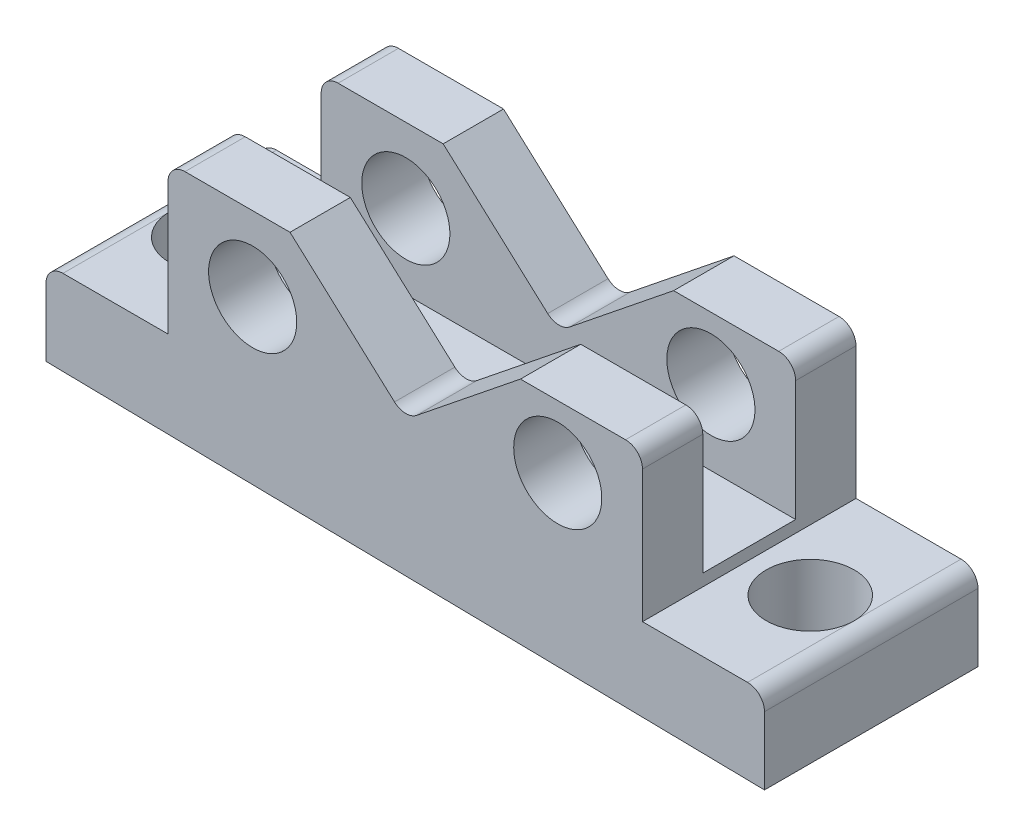
ISO-10303-21;
HEADER;
FILE_DESCRIPTION(('STEP AP214'),'2;1');
FILE_NAME('part.step','',(''),(''),'','','');
FILE_SCHEMA(('AUTOMOTIVE_DESIGN { 1 0 10303 214 1 1 1 1 }'));
ENDSEC;
DATA;
#1=APPLICATION_CONTEXT('core data for automotive mechanical design processes');
#2=APPLICATION_PROTOCOL_DEFINITION('international standard','automotive_design',2000,#1);
#3=PRODUCT_CONTEXT('',#1,'mechanical');
#4=PRODUCT('Part','Part','',(#3));
#5=PRODUCT_RELATED_PRODUCT_CATEGORY('part','',(#4));
#6=PRODUCT_DEFINITION_FORMATION('','',#4);
#7=PRODUCT_DEFINITION_CONTEXT('part definition',#1,'design');
#8=PRODUCT_DEFINITION('design','',#6,#7);
#9=PRODUCT_DEFINITION_SHAPE('','',#8);
#10=(LENGTH_UNIT() NAMED_UNIT(*) SI_UNIT(.MILLI.,.METRE.));
#11=(NAMED_UNIT(*) PLANE_ANGLE_UNIT() SI_UNIT($,.RADIAN.));
#12=(NAMED_UNIT(*) SI_UNIT($,.STERADIAN.) SOLID_ANGLE_UNIT());
#13=UNCERTAINTY_MEASURE_WITH_UNIT(LENGTH_MEASURE(1.E-05),#10,'distance_accuracy_value','');
#14=(GEOMETRIC_REPRESENTATION_CONTEXT(3) GLOBAL_UNCERTAINTY_ASSIGNED_CONTEXT((#13)) GLOBAL_UNIT_ASSIGNED_CONTEXT((#10,
#11,#12)) REPRESENTATION_CONTEXT('',''));
#15=CARTESIAN_POINT('',(0.,0.,0.));
#16=DIRECTION('',(0.,0.,1.));
#17=DIRECTION('',(1.,0.,0.));
#18=AXIS2_PLACEMENT_3D('',#15,#16,#17);
#19=CARTESIAN_POINT('',(176.,65.4832020096628,63.));
#20=DIRECTION('',(0.,-1.,0.));
#21=DIRECTION('',(0.,0.,-1.));
#22=AXIS2_PLACEMENT_3D('',#19,#20,#21);
#23=PLANE('',#22);
#24=DIRECTION('',(1.,0.,0.));
#25=VECTOR('',#24,1.);
#26=CARTESIAN_POINT('',(176.,65.4832020096628,17.8074312530399));
#27=LINE('',#26,#25);
#28=CARTESIAN_POINT('',(140.,65.4832020096628,17.8074312530399));
#29=VERTEX_POINT('',#28);
#30=CARTESIAN_POINT('',(171.,65.4832020096628,17.8074312530399));
#31=VERTEX_POINT('',#30);
#32=EDGE_CURVE('E453',#29,#31,#27,.T.);
#33=ORIENTED_EDGE('',*,*,#32,.T.);
#34=DIRECTION('',(0.,0.,-1.));
#35=VECTOR('',#34,1.);
#36=CARTESIAN_POINT('',(171.,65.4832020096628,63.));
#37=LINE('',#36,#35);
#38=CARTESIAN_POINT('',(171.,65.4832020096628,0.));
#39=VERTEX_POINT('',#38);
#40=EDGE_CURVE('E318',#31,#39,#37,.T.);
#41=ORIENTED_EDGE('',*,*,#40,.T.);
#42=DIRECTION('',(-1.,0.,0.));
#43=VECTOR('',#42,1.);
#44=CARTESIAN_POINT('',(176.,65.4832020096628,0.));
#45=LINE('',#44,#43);
#46=CARTESIAN_POINT('',(140.,65.4832020096628,0.));
#47=VERTEX_POINT('',#46);
#48=EDGE_CURVE('E407',#39,#47,#45,.T.);
#49=ORIENTED_EDGE('',*,*,#48,.T.);
#50=DIRECTION('',(0.,0.,-1.));
#51=VECTOR('',#50,1.);
#52=CARTESIAN_POINT('',(140.,65.4832020096628,63.));
#53=LINE('',#52,#51);
#54=EDGE_CURVE('E247',#29,#47,#53,.T.);
#55=ORIENTED_EDGE('',*,*,#54,.F.);
#56=EDGE_LOOP('',(#33,#41,#49,#55));
#57=FACE_BOUND('',#56,.T.);
#58=ADVANCED_FACE('F33',(#57),#23,.F.);
#59=CARTESIAN_POINT('',(106.,38.1932207706609,63.));
#60=DIRECTION('',(0.625952716539605,-0.779861011114602,0.));
#61=DIRECTION('',(0.779861011114602,0.625952716539605,0.));
#62=AXIS2_PLACEMENT_3D('',#59,#60,#61);
#63=PLANE('',#62);
#64=DIRECTION('',(-0.779861011114602,-0.625952716539605,0.));
#65=VECTOR('',#64,1.);
#66=CARTESIAN_POINT('',(106.,38.1932207706609,0.));
#67=LINE('',#66,#65);
#68=CARTESIAN_POINT('',(109.326280128855,40.8630478974877,0.));
#69=VERTEX_POINT('',#68);
#70=EDGE_CURVE('E409',#47,#69,#67,.T.);
#71=ORIENTED_EDGE('',*,*,#70,.T.);
#72=DIRECTION('',(0.,0.,-1.));
#73=VECTOR('',#72,1.);
#74=CARTESIAN_POINT('',(109.326280128855,40.8630478974877,17.8074312530399));
#75=LINE('',#74,#73);
#76=CARTESIAN_POINT('',(109.326280128855,40.8630478974877,17.8074312530399));
#77=VERTEX_POINT('',#76);
#78=EDGE_CURVE('E283',#69,#77,#75,.F.);
#79=ORIENTED_EDGE('',*,*,#78,.T.);
#80=DIRECTION('',(0.779861011114602,0.625952716539605,0.));
#81=VECTOR('',#80,1.);
#82=CARTESIAN_POINT('',(106.,38.1932207706609,17.8074312530399));
#83=LINE('',#82,#81);
#84=EDGE_CURVE('E451',#77,#29,#83,.T.);
#85=ORIENTED_EDGE('',*,*,#84,.T.);
#86=ORIENTED_EDGE('',*,*,#54,.T.);
#87=EDGE_LOOP('',(#71,#79,#85,#86));
#88=FACE_BOUND('',#87,.T.);
#89=ADVANCED_FACE('F489',(#88),#63,.F.);
#90=CARTESIAN_POINT('',(72.,69.,63.));
#91=DIRECTION('',(-0.671450960806052,-0.741048991115048,0.));
#92=DIRECTION('',(0.741048991115048,-0.671450960806052,0.));
#93=AXIS2_PLACEMENT_3D('',#90,#91,#92);
#94=PLANE('',#93);
#95=DIRECTION('',(0.741048991115048,-0.671450960806052,0.));
#96=VECTOR('',#95,1.);
#97=CARTESIAN_POINT('',(72.,69.,17.8074312530399));
#98=LINE('',#97,#96);
#99=CARTESIAN_POINT('',(72.,69.,17.8074312530399));
#100=VERTEX_POINT('',#99);
#101=CARTESIAN_POINT('',(102.839261742126,41.0571079974855,17.8074312530399));
#102=VERTEX_POINT('',#101);
#103=EDGE_CURVE('E274',#100,#102,#98,.T.);
#104=ORIENTED_EDGE('',*,*,#103,.T.);
#105=DIRECTION('',(0.,0.,-1.));
#106=VECTOR('',#105,1.);
#107=CARTESIAN_POINT('',(102.839261742126,41.0571079974855,0.));
#108=LINE('',#107,#106);
#109=CARTESIAN_POINT('',(102.839261742126,41.0571079974855,0.));
#110=VERTEX_POINT('',#109);
#111=EDGE_CURVE('E260',#102,#110,#108,.T.);
#112=ORIENTED_EDGE('',*,*,#111,.T.);
#113=DIRECTION('',(-0.741048991115048,0.671450960806052,0.));
#114=VECTOR('',#113,1.);
#115=CARTESIAN_POINT('',(72.,69.,0.));
#116=LINE('',#115,#114);
#117=CARTESIAN_POINT('',(72.,69.,0.));
#118=VERTEX_POINT('',#117);
#119=EDGE_CURVE('E412',#110,#118,#116,.T.);
#120=ORIENTED_EDGE('',*,*,#119,.T.);
#121=DIRECTION('',(0.,0.,-1.));
#122=VECTOR('',#121,1.);
#123=CARTESIAN_POINT('',(72.,69.,63.));
#124=LINE('',#123,#122);
#125=EDGE_CURVE('E235',#100,#118,#124,.T.);
#126=ORIENTED_EDGE('',*,*,#125,.F.);
#127=EDGE_LOOP('',(#104,#112,#120,#126));
#128=FACE_BOUND('',#127,.T.);
#129=ADVANCED_FACE('F496',(#128),#94,.F.);
#130=CARTESIAN_POINT('',(36.,69.,63.));
#131=DIRECTION('',(0.,-1.,0.));
#132=DIRECTION('',(0.,0.,-1.));
#133=AXIS2_PLACEMENT_3D('',#130,#131,#132);
#134=PLANE('',#133);
#135=DIRECTION('',(-1.,0.,0.));
#136=VECTOR('',#135,1.);
#137=CARTESIAN_POINT('',(36.,69.,0.));
#138=LINE('',#137,#136);
#139=CARTESIAN_POINT('',(41.,69.,0.));
#140=VERTEX_POINT('',#139);
#141=EDGE_CURVE('E414',#118,#140,#138,.T.);
#142=ORIENTED_EDGE('',*,*,#141,.T.);
#143=DIRECTION('',(0.,0.,-1.));
#144=VECTOR('',#143,1.);
#145=CARTESIAN_POINT('',(41.,69.,63.));
#146=LINE('',#145,#144);
#147=CARTESIAN_POINT('',(41.,69.,17.8074312530399));
#148=VERTEX_POINT('',#147);
#149=EDGE_CURVE('E339',#140,#148,#146,.F.);
#150=ORIENTED_EDGE('',*,*,#149,.T.);
#151=DIRECTION('',(-1.,0.,0.));
#152=VECTOR('',#151,1.);
#153=CARTESIAN_POINT('',(36.,69.,17.8074312530399));
#154=LINE('',#153,#152);
#155=EDGE_CURVE('E221',#100,#148,#154,.T.);
#156=ORIENTED_EDGE('',*,*,#155,.F.);
#157=ORIENTED_EDGE('',*,*,#125,.T.);
#158=EDGE_LOOP('',(#142,#150,#156,#157));
#159=FACE_BOUND('',#158,.T.);
#160=ADVANCED_FACE('F425',(#159),#134,.F.);
#161=CARTESIAN_POINT('',(36.,25.,63.));
#162=DIRECTION('',(1.,0.,0.));
#163=DIRECTION('',(0.,0.,-1.));
#164=AXIS2_PLACEMENT_3D('',#161,#162,#163);
#165=PLANE('',#164);
#166=DIRECTION('',(0.,1.,0.));
#167=VECTOR('',#166,1.);
#168=CARTESIAN_POINT('',(36.,25.,17.8074312530399));
#169=LINE('',#168,#167);
#170=CARTESIAN_POINT('',(36.,25.,17.8074312530399));
#171=VERTEX_POINT('',#170);
#172=CARTESIAN_POINT('',(36.,64.,17.8074312530399));
#173=VERTEX_POINT('',#172);
#174=EDGE_CURVE('E270',#171,#173,#169,.T.);
#175=ORIENTED_EDGE('',*,*,#174,.T.);
#176=DIRECTION('',(0.,0.,-1.));
#177=VECTOR('',#176,1.);
#178=CARTESIAN_POINT('',(36.,64.,63.));
#179=LINE('',#178,#177);
#180=CARTESIAN_POINT('',(36.,64.,0.));
#181=VERTEX_POINT('',#180);
#182=EDGE_CURVE('E334',#173,#181,#179,.T.);
#183=ORIENTED_EDGE('',*,*,#182,.T.);
#184=DIRECTION('',(0.,-1.,0.));
#185=VECTOR('',#184,1.);
#186=CARTESIAN_POINT('',(36.,25.,0.));
#187=LINE('',#186,#185);
#188=CARTESIAN_POINT('',(36.,25.,0.));
#189=VERTEX_POINT('',#188);
#190=EDGE_CURVE('E359',#181,#189,#187,.T.);
#191=ORIENTED_EDGE('',*,*,#190,.T.);
#192=DIRECTION('',(0.,0.,-1.));
#193=VECTOR('',#192,1.);
#194=CARTESIAN_POINT('',(36.,25.,63.));
#195=LINE('',#194,#193);
#196=EDGE_CURVE('E236',#171,#189,#195,.T.);
#197=ORIENTED_EDGE('',*,*,#196,.F.);
#198=EDGE_LOOP('',(#175,#183,#191,#197));
#199=FACE_BOUND('',#198,.T.);
#200=ADVANCED_FACE('F418',(#199),#165,.F.);
#201=CARTESIAN_POINT('',(150.998263923769,46.9959766993297,70.));
#202=DIRECTION('',(0.,0.,-1.));
#203=DIRECTION('',(-1.,0.,0.));
#204=AXIS2_PLACEMENT_3D('',#201,#202,#203);
#205=CYLINDRICAL_SURFACE('',#204,13.);
#206=CARTESIAN_POINT('',(150.998263923769,46.9959766993297,17.8074312530399));
#207=DIRECTION('',(0.,0.,-1.));
#208=DIRECTION('',(-1.,0.,0.));
#209=AXIS2_PLACEMENT_3D('',#206,#207,#208);
#210=CIRCLE('',#209,13.);
#211=CARTESIAN_POINT('',(137.998263923769,46.9959766993297,17.8074312530399));
#212=VERTEX_POINT('',#211);
#213=EDGE_CURVE('E271',#212,#212,#210,.F.);
#214=ORIENTED_EDGE('',*,*,#213,.T.);
#215=EDGE_LOOP('',(#214));
#216=FACE_BOUND('',#215,.T.);
#217=CARTESIAN_POINT('',(150.998263923769,46.9959766993297,0.));
#218=DIRECTION('',(0.,0.,-1.));
#219=DIRECTION('',(-1.,0.,0.));
#220=AXIS2_PLACEMENT_3D('',#217,#218,#219);
#221=CIRCLE('',#220,13.);
#222=CARTESIAN_POINT('',(137.998263923769,46.9959766993297,0.));
#223=VERTEX_POINT('',#222);
#224=EDGE_CURVE('E461',#223,#223,#221,.T.);
#225=ORIENTED_EDGE('',*,*,#224,.T.);
#226=EDGE_LOOP('',(#225));
#227=FACE_BOUND('',#226,.T.);
#228=ADVANCED_FACE('F474',(#216,#227),#205,.F.);
#229=CARTESIAN_POINT('',(0.,0.,63.));
#230=DIRECTION('',(1.,0.,0.));
#231=DIRECTION('',(0.,0.,-1.));
#232=AXIS2_PLACEMENT_3D('',#229,#230,#231);
#233=PLANE('',#232);
#234=DIRECTION('',(0.,-1.,0.));
#235=VECTOR('',#234,1.);
#236=CARTESIAN_POINT('',(0.,0.,63.));
#237=LINE('',#236,#235);
#238=CARTESIAN_POINT('',(0.,20.,63.));
#239=VERTEX_POINT('',#238);
#240=CARTESIAN_POINT('',(0.,0.,63.));
#241=VERTEX_POINT('',#240);
#242=EDGE_CURVE('E358',#239,#241,#237,.T.);
#243=ORIENTED_EDGE('',*,*,#242,.F.);
#244=DIRECTION('',(0.,0.,-1.));
#245=VECTOR('',#244,1.);
#246=CARTESIAN_POINT('',(0.,20.,63.));
#247=LINE('',#246,#245);
#248=CARTESIAN_POINT('',(0.,20.,0.));
#249=VERTEX_POINT('',#248);
#250=EDGE_CURVE('E343',#239,#249,#247,.T.);
#251=ORIENTED_EDGE('',*,*,#250,.T.);
#252=DIRECTION('',(0.,-1.,0.));
#253=VECTOR('',#252,1.);
#254=CARTESIAN_POINT('',(0.,0.,0.));
#255=LINE('',#254,#253);
#256=CARTESIAN_POINT('',(0.,0.,0.));
#257=VERTEX_POINT('',#256);
#258=EDGE_CURVE('E354',#249,#257,#255,.T.);
#259=ORIENTED_EDGE('',*,*,#258,.T.);
#260=DIRECTION('',(0.,0.,-1.));
#261=VECTOR('',#260,1.);
#262=CARTESIAN_POINT('',(0.,0.,63.));
#263=LINE('',#262,#261);
#264=EDGE_CURVE('E257',#241,#257,#263,.T.);
#265=ORIENTED_EDGE('',*,*,#264,.F.);
#266=EDGE_LOOP('',(#243,#251,#259,#265));
#267=FACE_BOUND('',#266,.T.);
#268=ADVANCED_FACE('F367',(#267),#233,.F.);
#269=CARTESIAN_POINT('',(0.,0.,63.));
#270=DIRECTION('',(0.0165863877687506,0.999862436408522,0.));
#271=DIRECTION('',(-0.999862436408522,0.0165863877687506,0.));
#272=AXIS2_PLACEMENT_3D('',#269,#270,#271);
#273=PLANE('',#272);
#274=CARTESIAN_POINT('',(18.,-0.298596055783348,31.5));
#275=DIRECTION('',(0.0165863877687506,0.999862436408522,0.));
#276=DIRECTION('',(-0.999862436408522,0.0165863877687506,0.));
#277=AXIS2_PLACEMENT_3D('',#274,#275,#276);
#278=ELLIPSE('',#277,13.0017885727317,13.);
#279=CARTESIAN_POINT('',(5.,-0.0829433488287094,31.5));
#280=VERTEX_POINT('',#279);
#281=EDGE_CURVE('E265',#280,#280,#278,.T.);
#282=ORIENTED_EDGE('',*,*,#281,.T.);
#283=EDGE_LOOP('',(#282));
#284=FACE_BOUND('',#283,.T.);
#285=CARTESIAN_POINT('',(194.,-3.21820193455384,31.5));
#286=DIRECTION('',(0.0165863877687506,0.999862436408522,0.));
#287=DIRECTION('',(-0.999862436408522,0.0165863877687506,0.));
#288=AXIS2_PLACEMENT_3D('',#285,#286,#287);
#289=ELLIPSE('',#288,13.0017885727317,13.);
#290=CARTESIAN_POINT('',(181.,-3.0025492275992,31.5));
#291=VERTEX_POINT('',#290);
#292=EDGE_CURVE('E264',#291,#291,#289,.T.);
#293=ORIENTED_EDGE('',*,*,#292,.T.);
#294=EDGE_LOOP('',(#293));
#295=FACE_BOUND('',#294,.T.);
#296=DIRECTION('',(0.999862436408521,-0.0165863877687506,0.));
#297=VECTOR('',#296,1.);
#298=CARTESIAN_POINT('',(0.,0.,0.));
#299=LINE('',#298,#297);
#300=CARTESIAN_POINT('',(212.,-3.51679799033719,0.));
#301=VERTEX_POINT('',#300);
#302=EDGE_CURVE('E397',#257,#301,#299,.T.);
#303=ORIENTED_EDGE('',*,*,#302,.T.);
#304=DIRECTION('',(0.,0.,-1.));
#305=VECTOR('',#304,1.);
#306=CARTESIAN_POINT('',(212.,-3.51679799033719,63.));
#307=LINE('',#306,#305);
#308=CARTESIAN_POINT('',(212.,-3.51679799033719,63.));
#309=VERTEX_POINT('',#308);
#310=EDGE_CURVE('E254',#309,#301,#307,.T.);
#311=ORIENTED_EDGE('',*,*,#310,.F.);
#312=DIRECTION('',(0.999862436408521,-0.0165863877687506,0.));
#313=VECTOR('',#312,1.);
#314=CARTESIAN_POINT('',(0.,0.,63.));
#315=LINE('',#314,#313);
#316=EDGE_CURVE('E368',#241,#309,#315,.T.);
#317=ORIENTED_EDGE('',*,*,#316,.F.);
#318=ORIENTED_EDGE('',*,*,#264,.T.);
#319=EDGE_LOOP('',(#303,#311,#317,#318));
#320=FACE_BOUND('',#319,.T.);
#321=ADVANCED_FACE('F639',(#284,#295,#320),#273,.F.);
#322=CARTESIAN_POINT('',(212.,-3.51679799033719,63.));
#323=DIRECTION('',(-1.,0.,0.));
#324=DIRECTION('',(0.,0.,1.));
#325=AXIS2_PLACEMENT_3D('',#322,#323,#324);
#326=PLANE('',#325);
#327=DIRECTION('',(0.,1.,0.));
#328=VECTOR('',#327,1.);
#329=CARTESIAN_POINT('',(212.,-3.51679799033719,0.));
#330=LINE('',#329,#328);
#331=CARTESIAN_POINT('',(212.,16.4832020096628,0.));
#332=VERTEX_POINT('',#331);
#333=EDGE_CURVE('E399',#301,#332,#330,.T.);
#334=ORIENTED_EDGE('',*,*,#333,.T.);
#335=DIRECTION('',(0.,0.,-1.));
#336=VECTOR('',#335,1.);
#337=CARTESIAN_POINT('',(212.,16.4832020096628,63.));
#338=LINE('',#337,#336);
#339=CARTESIAN_POINT('',(212.,16.4832020096628,63.));
#340=VERTEX_POINT('',#339);
#341=EDGE_CURVE('E305',#332,#340,#338,.F.);
#342=ORIENTED_EDGE('',*,*,#341,.T.);
#343=DIRECTION('',(0.,1.,0.));
#344=VECTOR('',#343,1.);
#345=CARTESIAN_POINT('',(212.,-3.51679799033719,63.));
#346=LINE('',#345,#344);
#347=EDGE_CURVE('E370',#309,#340,#346,.T.);
#348=ORIENTED_EDGE('',*,*,#347,.F.);
#349=ORIENTED_EDGE('',*,*,#310,.T.);
#350=EDGE_LOOP('',(#334,#342,#348,#349));
#351=FACE_BOUND('',#350,.T.);
#352=ADVANCED_FACE('F749',(#351),#326,.F.);
#353=CARTESIAN_POINT('',(212.,21.4832020096628,63.));
#354=DIRECTION('',(0.,-1.,0.));
#355=DIRECTION('',(1.,0.,0.));
#356=AXIS2_PLACEMENT_3D('',#353,#354,#355);
#357=PLANE('',#356);
#358=DIRECTION('',(-1.,0.,0.));
#359=VECTOR('',#358,1.);
#360=CARTESIAN_POINT('',(212.,21.4832020096628,63.));
#361=LINE('',#360,#359);
#362=CARTESIAN_POINT('',(207.,21.4832020096628,63.));
#363=VERTEX_POINT('',#362);
#364=CARTESIAN_POINT('',(176.,21.4832020096628,63.));
#365=VERTEX_POINT('',#364);
#366=EDGE_CURVE('E378',#363,#365,#361,.T.);
#367=ORIENTED_EDGE('',*,*,#366,.F.);
#368=DIRECTION('',(0.,0.,-1.));
#369=VECTOR('',#368,1.);
#370=CARTESIAN_POINT('',(207.,21.4832020096628,63.));
#371=LINE('',#370,#369);
#372=CARTESIAN_POINT('',(207.,21.4832020096628,31.5));
#373=VERTEX_POINT('',#372);
#374=EDGE_CURVE('E300',#363,#373,#371,.T.);
#375=ORIENTED_EDGE('',*,*,#374,.T.);
#376=CARTESIAN_POINT('',(194.,21.4832020096628,31.5));
#377=DIRECTION('',(0.,-1.,0.));
#378=DIRECTION('',(1.,0.,0.));
#379=AXIS2_PLACEMENT_3D('',#376,#377,#378);
#380=CIRCLE('',#379,13.);
#381=EDGE_CURVE('E261',#373,#373,#380,.T.);
#382=ORIENTED_EDGE('',*,*,#381,.T.);
#383=DIRECTION('',(0.,0.,-1.));
#384=VECTOR('',#383,1.);
#385=CARTESIAN_POINT('',(207.,21.4832020096628,63.));
#386=LINE('',#385,#384);
#387=CARTESIAN_POINT('',(207.,21.4832020096628,0.));
#388=VERTEX_POINT('',#387);
#389=EDGE_CURVE('E298',#373,#388,#386,.T.);
#390=ORIENTED_EDGE('',*,*,#389,.T.);
#391=DIRECTION('',(-1.,0.,0.));
#392=VECTOR('',#391,1.);
#393=CARTESIAN_POINT('',(212.,21.4832020096628,0.));
#394=LINE('',#393,#392);
#395=CARTESIAN_POINT('',(176.,21.4832020096628,0.));
#396=VERTEX_POINT('',#395);
#397=EDGE_CURVE('E402',#388,#396,#394,.T.);
#398=ORIENTED_EDGE('',*,*,#397,.T.);
#399=DIRECTION('',(0.,0.,-1.));
#400=VECTOR('',#399,1.);
#401=CARTESIAN_POINT('',(176.,21.4832020096628,63.));
#402=LINE('',#401,#400);
#403=EDGE_CURVE('E251',#365,#396,#402,.T.);
#404=ORIENTED_EDGE('',*,*,#403,.F.);
#405=EDGE_LOOP('',(#367,#375,#382,#390,#398,#404));
#406=FACE_BOUND('',#405,.T.);
#407=ADVANCED_FACE('F510',(#406),#357,.F.);
#408=CARTESIAN_POINT('',(176.,21.4832020096628,63.));
#409=DIRECTION('',(-1.,0.,0.));
#410=DIRECTION('',(0.,0.,1.));
#411=AXIS2_PLACEMENT_3D('',#408,#409,#410);
#412=PLANE('',#411);
#413=DIRECTION('',(0.,1.,0.));
#414=VECTOR('',#413,1.);
#415=CARTESIAN_POINT('',(176.,21.4832020096628,0.));
#416=LINE('',#415,#414);
#417=CARTESIAN_POINT('',(176.,60.4832020096628,0.));
#418=VERTEX_POINT('',#417);
#419=EDGE_CURVE('E404',#396,#418,#416,.T.);
#420=ORIENTED_EDGE('',*,*,#419,.T.);
#421=DIRECTION('',(0.,0.,-1.));
#422=VECTOR('',#421,1.);
#423=CARTESIAN_POINT('',(176.,60.4832020096628,63.));
#424=LINE('',#423,#422);
#425=CARTESIAN_POINT('',(176.,60.4832020096628,17.8074312530399));
#426=VERTEX_POINT('',#425);
#427=EDGE_CURVE('E323',#418,#426,#424,.F.);
#428=ORIENTED_EDGE('',*,*,#427,.T.);
#429=DIRECTION('',(0.,1.,0.));
#430=VECTOR('',#429,1.);
#431=CARTESIAN_POINT('',(176.,25.,17.8074312530399));
#432=LINE('',#431,#430);
#433=CARTESIAN_POINT('',(176.,25.,17.8074312530399));
#434=VERTEX_POINT('',#433);
#435=EDGE_CURVE('E435',#434,#426,#432,.T.);
#436=ORIENTED_EDGE('',*,*,#435,.F.);
#437=DIRECTION('',(0.,0.,-1.));
#438=VECTOR('',#437,1.);
#439=CARTESIAN_POINT('',(176.,25.,17.8074312530399));
#440=LINE('',#439,#438);
#441=CARTESIAN_POINT('',(176.,25.,45.2057456013071));
#442=VERTEX_POINT('',#441);
#443=EDGE_CURVE('E220',#442,#434,#440,.T.);
#444=ORIENTED_EDGE('',*,*,#443,.F.);
#445=DIRECTION('',(0.,1.,0.));
#446=VECTOR('',#445,1.);
#447=CARTESIAN_POINT('',(176.,25.,45.2057456013071));
#448=LINE('',#447,#446);
#449=CARTESIAN_POINT('',(176.,60.4832020096628,45.2057456013071));
#450=VERTEX_POINT('',#449);
#451=EDGE_CURVE('E217',#442,#450,#448,.T.);
#452=ORIENTED_EDGE('',*,*,#451,.T.);
#453=DIRECTION('',(0.,0.,-1.));
#454=VECTOR('',#453,1.);
#455=CARTESIAN_POINT('',(176.,60.4832020096628,63.));
#456=LINE('',#455,#454);
#457=CARTESIAN_POINT('',(176.,60.4832020096628,63.));
#458=VERTEX_POINT('',#457);
#459=EDGE_CURVE('E314',#450,#458,#456,.F.);
#460=ORIENTED_EDGE('',*,*,#459,.T.);
#461=DIRECTION('',(0.,1.,0.));
#462=VECTOR('',#461,1.);
#463=CARTESIAN_POINT('',(176.,21.4832020096628,63.));
#464=LINE('',#463,#462);
#465=EDGE_CURVE('E380',#365,#458,#464,.T.);
#466=ORIENTED_EDGE('',*,*,#465,.F.);
#467=ORIENTED_EDGE('',*,*,#403,.T.);
#468=EDGE_LOOP('',(#420,#428,#436,#444,#452,#460,#466,#467));
#469=FACE_BOUND('',#468,.T.);
#470=ADVANCED_FACE('F502',(#469),#412,.F.);
#471=DIRECTION('',(-1.,0.,0.));
#472=VECTOR('',#471,1.);
#473=CARTESIAN_POINT('',(176.,65.4832020096628,63.));
#474=LINE('',#473,#472);
#475=CARTESIAN_POINT('',(171.,65.4832020096628,63.));
#476=VERTEX_POINT('',#475);
#477=CARTESIAN_POINT('',(140.,65.4832020096628,63.));
#478=VERTEX_POINT('',#477);
#479=EDGE_CURVE('E383',#476,#478,#474,.T.);
#480=ORIENTED_EDGE('',*,*,#479,.F.);
#481=DIRECTION('',(0.,0.,-1.));
#482=VECTOR('',#481,1.);
#483=CARTESIAN_POINT('',(171.,65.4832020096628,63.));
#484=LINE('',#483,#482);
#485=CARTESIAN_POINT('',(171.,65.4832020096628,45.2057456013071));
#486=VERTEX_POINT('',#485);
#487=EDGE_CURVE('E309',#476,#486,#484,.T.);
#488=ORIENTED_EDGE('',*,*,#487,.T.);
#489=DIRECTION('',(-1.,0.,0.));
#490=VECTOR('',#489,1.);
#491=CARTESIAN_POINT('',(176.,65.4832020096628,45.2057456013071));
#492=LINE('',#491,#490);
#493=CARTESIAN_POINT('',(140.,65.4832020096628,45.2057456013071));
#494=VERTEX_POINT('',#493);
#495=EDGE_CURVE('E275',#486,#494,#492,.T.);
#496=ORIENTED_EDGE('',*,*,#495,.T.);
#497=EDGE_CURVE('E248',#478,#494,#53,.T.);
#498=ORIENTED_EDGE('',*,*,#497,.F.);
#499=EDGE_LOOP('',(#480,#488,#496,#498));
#500=FACE_BOUND('',#499,.T.);
#501=ADVANCED_FACE('F492',(#500),#23,.F.);
#502=DIRECTION('',(-0.779861011114602,-0.625952716539605,0.));
#503=VECTOR('',#502,1.);
#504=CARTESIAN_POINT('',(106.,38.1932207706609,45.2057456013071));
#505=LINE('',#504,#503);
#506=CARTESIAN_POINT('',(109.326280128855,40.8630478974877,45.2057456013071));
#507=VERTEX_POINT('',#506);
#508=EDGE_CURVE('E445',#494,#507,#505,.T.);
#509=ORIENTED_EDGE('',*,*,#508,.T.);
#510=DIRECTION('',(0.,0.,-1.));
#511=VECTOR('',#510,1.);
#512=CARTESIAN_POINT('',(109.326280128855,40.8630478974877,63.));
#513=LINE('',#512,#511);
#514=CARTESIAN_POINT('',(109.326280128855,40.8630478974877,63.));
#515=VERTEX_POINT('',#514);
#516=EDGE_CURVE('E292',#507,#515,#513,.F.);
#517=ORIENTED_EDGE('',*,*,#516,.T.);
#518=DIRECTION('',(-0.779861011114602,-0.625952716539605,0.));
#519=VECTOR('',#518,1.);
#520=CARTESIAN_POINT('',(106.,38.1932207706609,63.));
#521=LINE('',#520,#519);
#522=EDGE_CURVE('E385',#478,#515,#521,.T.);
#523=ORIENTED_EDGE('',*,*,#522,.F.);
#524=ORIENTED_EDGE('',*,*,#497,.T.);
#525=EDGE_LOOP('',(#509,#517,#523,#524));
#526=FACE_BOUND('',#525,.T.);
#527=ADVANCED_FACE('F499',(#526),#63,.F.);
#528=DIRECTION('',(-0.741048991115048,0.671450960806052,0.));
#529=VECTOR('',#528,1.);
#530=CARTESIAN_POINT('',(72.,69.,63.));
#531=LINE('',#530,#529);
#532=CARTESIAN_POINT('',(102.839261742126,41.0571079974855,63.));
#533=VERTEX_POINT('',#532);
#534=CARTESIAN_POINT('',(72.,69.,63.));
#535=VERTEX_POINT('',#534);
#536=EDGE_CURVE('E388',#533,#535,#531,.T.);
#537=ORIENTED_EDGE('',*,*,#536,.F.);
#538=DIRECTION('',(0.,0.,-1.));
#539=VECTOR('',#538,1.);
#540=CARTESIAN_POINT('',(102.839261742126,41.0571079974855,45.2057456013071));
#541=LINE('',#540,#539);
#542=CARTESIAN_POINT('',(102.839261742126,41.0571079974855,45.2057456013071));
#543=VERTEX_POINT('',#542);
#544=EDGE_CURVE('E289',#533,#543,#541,.T.);
#545=ORIENTED_EDGE('',*,*,#544,.T.);
#546=DIRECTION('',(-0.741048991115048,0.671450960806052,0.));
#547=VECTOR('',#546,1.);
#548=CARTESIAN_POINT('',(72.,69.,45.2057456013071));
#549=LINE('',#548,#547);
#550=CARTESIAN_POINT('',(72.,69.,45.2057456013071));
#551=VERTEX_POINT('',#550);
#552=EDGE_CURVE('E269',#543,#551,#549,.T.);
#553=ORIENTED_EDGE('',*,*,#552,.T.);
#554=EDGE_CURVE('E239',#535,#551,#124,.T.);
#555=ORIENTED_EDGE('',*,*,#554,.F.);
#556=EDGE_LOOP('',(#537,#545,#553,#555));
#557=FACE_BOUND('',#556,.T.);
#558=ADVANCED_FACE('F508',(#557),#94,.F.);
#559=DIRECTION('',(1.,0.,0.));
#560=VECTOR('',#559,1.);
#561=CARTESIAN_POINT('',(36.,69.,45.2057456013071));
#562=LINE('',#561,#560);
#563=CARTESIAN_POINT('',(41.,69.,45.2057456013071));
#564=VERTEX_POINT('',#563);
#565=EDGE_CURVE('E527',#564,#551,#562,.T.);
#566=ORIENTED_EDGE('',*,*,#565,.F.);
#567=DIRECTION('',(0.,0.,-1.));
#568=VECTOR('',#567,1.);
#569=CARTESIAN_POINT('',(41.,69.,63.));
#570=LINE('',#569,#568);
#571=CARTESIAN_POINT('',(41.,69.,63.));
#572=VERTEX_POINT('',#571);
#573=EDGE_CURVE('E330',#564,#572,#570,.F.);
#574=ORIENTED_EDGE('',*,*,#573,.T.);
#575=DIRECTION('',(-1.,0.,0.));
#576=VECTOR('',#575,1.);
#577=CARTESIAN_POINT('',(36.,69.,63.));
#578=LINE('',#577,#576);
#579=EDGE_CURVE('E390',#535,#572,#578,.T.);
#580=ORIENTED_EDGE('',*,*,#579,.F.);
#581=ORIENTED_EDGE('',*,*,#554,.T.);
#582=EDGE_LOOP('',(#566,#574,#580,#581));
#583=FACE_BOUND('',#582,.T.);
#584=ADVANCED_FACE('F551',(#583),#134,.F.);
#585=DIRECTION('',(0.,-1.,0.));
#586=VECTOR('',#585,1.);
#587=CARTESIAN_POINT('',(36.,25.,63.));
#588=LINE('',#587,#586);
#589=CARTESIAN_POINT('',(36.,64.,63.));
#590=VERTEX_POINT('',#589);
#591=CARTESIAN_POINT('',(36.,25.,63.));
#592=VERTEX_POINT('',#591);
#593=EDGE_CURVE('E393',#590,#592,#588,.T.);
#594=ORIENTED_EDGE('',*,*,#593,.F.);
#595=DIRECTION('',(0.,0.,-1.));
#596=VECTOR('',#595,1.);
#597=CARTESIAN_POINT('',(36.,64.,63.));
#598=LINE('',#597,#596);
#599=CARTESIAN_POINT('',(36.,64.,45.2057456013071));
#600=VERTEX_POINT('',#599);
#601=EDGE_CURVE('E230',#590,#600,#598,.T.);
#602=ORIENTED_EDGE('',*,*,#601,.T.);
#603=DIRECTION('',(0.,1.,0.));
#604=VECTOR('',#603,1.);
#605=CARTESIAN_POINT('',(36.,25.,45.2057456013071));
#606=LINE('',#605,#604);
#607=CARTESIAN_POINT('',(36.,25.,45.2057456013071));
#608=VERTEX_POINT('',#607);
#609=EDGE_CURVE('E215',#608,#600,#606,.T.);
#610=ORIENTED_EDGE('',*,*,#609,.F.);
#611=EDGE_CURVE('E228',#592,#608,#195,.T.);
#612=ORIENTED_EDGE('',*,*,#611,.F.);
#613=EDGE_LOOP('',(#594,#602,#610,#612));
#614=FACE_BOUND('',#613,.T.);
#615=ADVANCED_FACE('F227',(#614),#165,.F.);
#616=CARTESIAN_POINT('',(0.,25.,63.));
#617=DIRECTION('',(0.,-1.,0.));
#618=DIRECTION('',(0.,0.,-1.));
#619=AXIS2_PLACEMENT_3D('',#616,#617,#618);
#620=PLANE('',#619);
#621=DIRECTION('',(-1.,0.,0.));
#622=VECTOR('',#621,1.);
#623=CARTESIAN_POINT('',(0.,25.,0.));
#624=LINE('',#623,#622);
#625=CARTESIAN_POINT('',(5.,25.,0.));
#626=VERTEX_POINT('',#625);
#627=EDGE_CURVE('E243',#189,#626,#624,.T.);
#628=ORIENTED_EDGE('',*,*,#627,.T.);
#629=DIRECTION('',(0.,0.,-1.));
#630=VECTOR('',#629,1.);
#631=CARTESIAN_POINT('',(5.,25.,63.));
#632=LINE('',#631,#630);
#633=CARTESIAN_POINT('',(5.,25.,31.5));
#634=VERTEX_POINT('',#633);
#635=EDGE_CURVE('E41',#626,#634,#632,.F.);
#636=ORIENTED_EDGE('',*,*,#635,.T.);
#637=CARTESIAN_POINT('',(18.,25.,31.5));
#638=DIRECTION('',(0.,1.,0.));
#639=DIRECTION('',(0.,0.,1.));
#640=AXIS2_PLACEMENT_3D('',#637,#638,#639);
#641=CIRCLE('',#640,13.);
#642=EDGE_CURVE('E456',#634,#634,#641,.T.);
#643=ORIENTED_EDGE('',*,*,#642,.F.);
#644=DIRECTION('',(0.,0.,-1.));
#645=VECTOR('',#644,1.);
#646=CARTESIAN_POINT('',(5.,25.,63.));
#647=LINE('',#646,#645);
#648=CARTESIAN_POINT('',(5.,25.,63.));
#649=VERTEX_POINT('',#648);
#650=EDGE_CURVE('E48',#634,#649,#647,.F.);
#651=ORIENTED_EDGE('',*,*,#650,.T.);
#652=DIRECTION('',(-1.,0.,0.));
#653=VECTOR('',#652,1.);
#654=CARTESIAN_POINT('',(0.,25.,63.));
#655=LINE('',#654,#653);
#656=EDGE_CURVE('E234',#592,#649,#655,.T.);
#657=ORIENTED_EDGE('',*,*,#656,.F.);
#658=ORIENTED_EDGE('',*,*,#611,.T.);
#659=DIRECTION('',(1.,0.,0.));
#660=VECTOR('',#659,1.);
#661=CARTESIAN_POINT('',(36.,25.,45.2057456013071));
#662=LINE('',#661,#660);
#663=EDGE_CURVE('E212',#608,#442,#662,.T.);
#664=ORIENTED_EDGE('',*,*,#663,.T.);
#665=ORIENTED_EDGE('',*,*,#443,.T.);
#666=DIRECTION('',(-1.,0.,0.));
#667=VECTOR('',#666,1.);
#668=CARTESIAN_POINT('',(36.,25.,17.8074312530399));
#669=LINE('',#668,#667);
#670=EDGE_CURVE('E231',#434,#171,#669,.T.);
#671=ORIENTED_EDGE('',*,*,#670,.T.);
#672=ORIENTED_EDGE('',*,*,#196,.T.);
#673=EDGE_LOOP('',(#628,#636,#643,#651,#657,#658,#664,#665,#671,#672));
#674=FACE_BOUND('',#673,.T.);
#675=ADVANCED_FACE('F233',(#674),#620,.F.);
#676=CARTESIAN_POINT('',(0.,0.,63.));
#677=DIRECTION('',(0.,0.,-1.));
#678=DIRECTION('',(-1.,0.,0.));
#679=AXIS2_PLACEMENT_3D('',#676,#677,#678);
#680=PLANE('',#679);
#681=CARTESIAN_POINT('',(60.9743561698234,46.9788040126224,63.));
#682=DIRECTION('',(0.,0.,1.));
#683=DIRECTION('',(1.,0.,0.));
#684=AXIS2_PLACEMENT_3D('',#681,#682,#683);
#685=CIRCLE('',#684,13.);
#686=CARTESIAN_POINT('',(73.9743561698234,46.9788040126224,63.));
#687=VERTEX_POINT('',#686);
#688=EDGE_CURVE('E280',#687,#687,#685,.T.);
#689=ORIENTED_EDGE('',*,*,#688,.F.);
#690=EDGE_LOOP('',(#689));
#691=FACE_BOUND('',#690,.T.);
#692=CARTESIAN_POINT('',(150.998263923769,46.9959766993297,63.));
#693=DIRECTION('',(0.,0.,-1.));
#694=DIRECTION('',(-1.,0.,0.));
#695=AXIS2_PLACEMENT_3D('',#692,#693,#694);
#696=CIRCLE('',#695,13.);
#697=CARTESIAN_POINT('',(137.998263923769,46.9959766993297,63.));
#698=VERTEX_POINT('',#697);
#699=EDGE_CURVE('E373',#698,#698,#696,.T.);
#700=ORIENTED_EDGE('',*,*,#699,.T.);
#701=EDGE_LOOP('',(#700));
#702=FACE_BOUND('',#701,.T.);
#703=ORIENTED_EDGE('',*,*,#656,.T.);
#704=CARTESIAN_POINT('',(5.,20.,63.));
#705=DIRECTION('',(0.,0.,-1.));
#706=DIRECTION('',(-1.,0.,0.));
#707=AXIS2_PLACEMENT_3D('',#704,#705,#706);
#708=CIRCLE('',#707,5.);
#709=EDGE_CURVE('E11',#649,#239,#708,.F.);
#710=ORIENTED_EDGE('',*,*,#709,.T.);
#711=ORIENTED_EDGE('',*,*,#242,.T.);
#712=ORIENTED_EDGE('',*,*,#316,.T.);
#713=ORIENTED_EDGE('',*,*,#347,.T.);
#714=CARTESIAN_POINT('',(207.,16.4832020096628,63.));
#715=DIRECTION('',(0.,0.,-1.));
#716=DIRECTION('',(-1.,0.,0.));
#717=AXIS2_PLACEMENT_3D('',#714,#715,#716);
#718=CIRCLE('',#717,5.);
#719=EDGE_CURVE('E307',#340,#363,#718,.F.);
#720=ORIENTED_EDGE('',*,*,#719,.T.);
#721=ORIENTED_EDGE('',*,*,#366,.T.);
#722=ORIENTED_EDGE('',*,*,#465,.T.);
#723=CARTESIAN_POINT('',(171.,60.4832020096628,63.));
#724=DIRECTION('',(0.,0.,-1.));
#725=DIRECTION('',(-1.,0.,0.));
#726=AXIS2_PLACEMENT_3D('',#723,#724,#725);
#727=CIRCLE('',#726,5.);
#728=EDGE_CURVE('E316',#458,#476,#727,.F.);
#729=ORIENTED_EDGE('',*,*,#728,.T.);
#730=ORIENTED_EDGE('',*,*,#479,.T.);
#731=ORIENTED_EDGE('',*,*,#522,.T.);
#732=CARTESIAN_POINT('',(106.196516546157,44.7623529530607,63.));
#733=DIRECTION('',(0.,0.,-1.));
#734=DIRECTION('',(-1.,0.,0.));
#735=AXIS2_PLACEMENT_3D('',#732,#733,#734);
#736=CIRCLE('',#735,5.);
#737=EDGE_CURVE('E296',#515,#533,#736,.T.);
#738=ORIENTED_EDGE('',*,*,#737,.T.);
#739=ORIENTED_EDGE('',*,*,#536,.T.);
#740=ORIENTED_EDGE('',*,*,#579,.T.);
#741=CARTESIAN_POINT('',(41.,64.,63.));
#742=DIRECTION('',(0.,0.,-1.));
#743=DIRECTION('',(-1.,0.,0.));
#744=AXIS2_PLACEMENT_3D('',#741,#742,#743);
#745=CIRCLE('',#744,5.);
#746=EDGE_CURVE('E332',#572,#590,#745,.F.);
#747=ORIENTED_EDGE('',*,*,#746,.T.);
#748=ORIENTED_EDGE('',*,*,#593,.T.);
#749=EDGE_LOOP('',(#703,#710,#711,#712,#713,#720,#721,#722,#729,#730,#731,#738,#739,#740,#747,#748));
#750=FACE_BOUND('',#749,.T.);
#751=ADVANCED_FACE('F363',(#691,#702,#750),#680,.F.);
#752=CARTESIAN_POINT('',(0.,0.,0.));
#753=DIRECTION('',(0.,0.,-1.));
#754=DIRECTION('',(-1.,0.,0.));
#755=AXIS2_PLACEMENT_3D('',#752,#753,#754);
#756=PLANE('',#755);
#757=CARTESIAN_POINT('',(60.9743561698234,46.9788040126224,0.));
#758=DIRECTION('',(0.,0.,-1.));
#759=DIRECTION('',(-1.,0.,0.));
#760=AXIS2_PLACEMENT_3D('',#757,#758,#759);
#761=CIRCLE('',#760,13.);
#762=CARTESIAN_POINT('',(47.9743561698234,46.9788040126224,0.));
#763=VERTEX_POINT('',#762);
#764=EDGE_CURVE('E528',#763,#763,#761,.T.);
#765=ORIENTED_EDGE('',*,*,#764,.F.);
#766=EDGE_LOOP('',(#765));
#767=FACE_BOUND('',#766,.T.);
#768=ORIENTED_EDGE('',*,*,#224,.F.);
#769=EDGE_LOOP('',(#768));
#770=FACE_BOUND('',#769,.T.);
#771=ORIENTED_EDGE('',*,*,#258,.F.);
#772=CARTESIAN_POINT('',(5.,20.,0.));
#773=DIRECTION('',(0.,0.,-1.));
#774=DIRECTION('',(-1.,0.,0.));
#775=AXIS2_PLACEMENT_3D('',#772,#773,#774);
#776=CIRCLE('',#775,5.);
#777=EDGE_CURVE('E346',#249,#626,#776,.T.);
#778=ORIENTED_EDGE('',*,*,#777,.T.);
#779=ORIENTED_EDGE('',*,*,#627,.F.);
#780=ORIENTED_EDGE('',*,*,#190,.F.);
#781=CARTESIAN_POINT('',(41.,64.,0.));
#782=DIRECTION('',(0.,0.,-1.));
#783=DIRECTION('',(-1.,0.,0.));
#784=AXIS2_PLACEMENT_3D('',#781,#782,#783);
#785=CIRCLE('',#784,5.);
#786=EDGE_CURVE('E337',#181,#140,#785,.T.);
#787=ORIENTED_EDGE('',*,*,#786,.T.);
#788=ORIENTED_EDGE('',*,*,#141,.F.);
#789=ORIENTED_EDGE('',*,*,#119,.F.);
#790=CARTESIAN_POINT('',(106.196516546157,44.7623529530607,0.));
#791=DIRECTION('',(0.,0.,-1.));
#792=DIRECTION('',(-1.,0.,0.));
#793=AXIS2_PLACEMENT_3D('',#790,#791,#792);
#794=CIRCLE('',#793,5.);
#795=EDGE_CURVE('E285',#110,#69,#794,.F.);
#796=ORIENTED_EDGE('',*,*,#795,.T.);
#797=ORIENTED_EDGE('',*,*,#70,.F.);
#798=ORIENTED_EDGE('',*,*,#48,.F.);
#799=CARTESIAN_POINT('',(171.,60.4832020096628,0.));
#800=DIRECTION('',(0.,0.,-1.));
#801=DIRECTION('',(-1.,0.,0.));
#802=AXIS2_PLACEMENT_3D('',#799,#800,#801);
#803=CIRCLE('',#802,5.);
#804=EDGE_CURVE('E321',#39,#418,#803,.T.);
#805=ORIENTED_EDGE('',*,*,#804,.T.);
#806=ORIENTED_EDGE('',*,*,#419,.F.);
#807=ORIENTED_EDGE('',*,*,#397,.F.);
#808=CARTESIAN_POINT('',(207.,16.4832020096628,0.));
#809=DIRECTION('',(0.,0.,-1.));
#810=DIRECTION('',(-1.,0.,0.));
#811=AXIS2_PLACEMENT_3D('',#808,#809,#810);
#812=CIRCLE('',#811,5.);
#813=EDGE_CURVE('E303',#388,#332,#812,.T.);
#814=ORIENTED_EDGE('',*,*,#813,.T.);
#815=ORIENTED_EDGE('',*,*,#333,.F.);
#816=ORIENTED_EDGE('',*,*,#302,.F.);
#817=EDGE_LOOP('',(#771,#778,#779,#780,#787,#788,#789,#796,#797,#798,#805,#806,#807,#814,#815,#816));
#818=FACE_BOUND('',#817,.T.);
#819=ADVANCED_FACE('F351',(#767,#770,#818),#756,.T.);
#820=CARTESIAN_POINT('',(150.998263923769,46.9959766993297,45.2057456013071));
#821=DIRECTION('',(0.,0.,1.));
#822=DIRECTION('',(1.,0.,0.));
#823=AXIS2_PLACEMENT_3D('',#820,#821,#822);
#824=CIRCLE('',#823,13.);
#825=CARTESIAN_POINT('',(163.998263923769,46.9959766993297,45.2057456013071));
#826=VERTEX_POINT('',#825);
#827=EDGE_CURVE('E266',#826,#826,#824,.F.);
#828=ORIENTED_EDGE('',*,*,#827,.T.);
#829=EDGE_LOOP('',(#828));
#830=FACE_BOUND('',#829,.T.);
#831=ORIENTED_EDGE('',*,*,#699,.F.);
#832=EDGE_LOOP('',(#831));
#833=FACE_BOUND('',#832,.T.);
#834=ADVANCED_FACE('F469',(#830,#833),#205,.F.);
#835=CARTESIAN_POINT('',(18.,-45.,31.5));
#836=DIRECTION('',(0.,1.,0.));
#837=DIRECTION('',(0.,0.,1.));
#838=AXIS2_PLACEMENT_3D('',#835,#836,#837);
#839=CYLINDRICAL_SURFACE('',#838,13.);
#840=ORIENTED_EDGE('',*,*,#642,.T.);
#841=EDGE_LOOP('',(#840));
#842=FACE_BOUND('',#841,.T.);
#843=ORIENTED_EDGE('',*,*,#281,.F.);
#844=EDGE_LOOP('',(#843));
#845=FACE_BOUND('',#844,.T.);
#846=ADVANCED_FACE('F471',(#842,#845),#839,.F.);
#847=CARTESIAN_POINT('',(194.,-45.,31.5));
#848=DIRECTION('',(0.,1.,0.));
#849=DIRECTION('',(0.,0.,1.));
#850=AXIS2_PLACEMENT_3D('',#847,#848,#849);
#851=CYLINDRICAL_SURFACE('',#850,13.);
#852=ORIENTED_EDGE('',*,*,#381,.F.);
#853=EDGE_LOOP('',(#852));
#854=FACE_BOUND('',#853,.T.);
#855=ORIENTED_EDGE('',*,*,#292,.F.);
#856=EDGE_LOOP('',(#855));
#857=FACE_BOUND('',#856,.T.);
#858=ADVANCED_FACE('F479',(#854,#857),#851,.F.);
#859=CARTESIAN_POINT('',(36.,25.,17.8074312530399));
#860=DIRECTION('',(0.,0.,-1.));
#861=DIRECTION('',(-1.,0.,0.));
#862=AXIS2_PLACEMENT_3D('',#859,#860,#861);
#863=PLANE('',#862);
#864=CARTESIAN_POINT('',(60.9743561698234,46.9788040126224,17.8074312530399));
#865=DIRECTION('',(0.,0.,-1.));
#866=DIRECTION('',(-1.,0.,0.));
#867=AXIS2_PLACEMENT_3D('',#864,#865,#866);
#868=CIRCLE('',#867,13.);
#869=CARTESIAN_POINT('',(47.9743561698234,46.9788040126224,17.8074312530399));
#870=VERTEX_POINT('',#869);
#871=EDGE_CURVE('E279',#870,#870,#868,.T.);
#872=ORIENTED_EDGE('',*,*,#871,.T.);
#873=EDGE_LOOP('',(#872));
#874=FACE_BOUND('',#873,.T.);
#875=ORIENTED_EDGE('',*,*,#213,.F.);
#876=EDGE_LOOP('',(#875));
#877=FACE_BOUND('',#876,.T.);
#878=ORIENTED_EDGE('',*,*,#155,.T.);
#879=CARTESIAN_POINT('',(41.,64.,17.8074312530399));
#880=DIRECTION('',(0.,0.,-1.));
#881=DIRECTION('',(-1.,0.,0.));
#882=AXIS2_PLACEMENT_3D('',#879,#880,#881);
#883=CIRCLE('',#882,5.);
#884=EDGE_CURVE('E341',#148,#173,#883,.F.);
#885=ORIENTED_EDGE('',*,*,#884,.T.);
#886=ORIENTED_EDGE('',*,*,#174,.F.);
#887=ORIENTED_EDGE('',*,*,#670,.F.);
#888=ORIENTED_EDGE('',*,*,#435,.T.);
#889=CARTESIAN_POINT('',(171.,60.4832020096628,17.8074312530399));
#890=DIRECTION('',(0.,0.,-1.));
#891=DIRECTION('',(-1.,0.,0.));
#892=AXIS2_PLACEMENT_3D('',#889,#890,#891);
#893=CIRCLE('',#892,5.);
#894=EDGE_CURVE('E325',#426,#31,#893,.F.);
#895=ORIENTED_EDGE('',*,*,#894,.T.);
#896=ORIENTED_EDGE('',*,*,#32,.F.);
#897=ORIENTED_EDGE('',*,*,#84,.F.);
#898=CARTESIAN_POINT('',(106.196516546157,44.7623529530607,17.8074312530399));
#899=DIRECTION('',(0.,0.,-1.));
#900=DIRECTION('',(-1.,0.,0.));
#901=AXIS2_PLACEMENT_3D('',#898,#899,#900);
#902=CIRCLE('',#901,5.);
#903=EDGE_CURVE('E287',#77,#102,#902,.T.);
#904=ORIENTED_EDGE('',*,*,#903,.T.);
#905=ORIENTED_EDGE('',*,*,#103,.F.);
#906=EDGE_LOOP('',(#878,#885,#886,#887,#888,#895,#896,#897,#904,#905));
#907=FACE_BOUND('',#906,.T.);
#908=ADVANCED_FACE('F433',(#874,#877,#907),#863,.F.);
#909=CARTESIAN_POINT('',(36.,25.,45.2057456013071));
#910=DIRECTION('',(0.,0.,1.));
#911=DIRECTION('',(1.,0.,0.));
#912=AXIS2_PLACEMENT_3D('',#909,#910,#911);
#913=PLANE('',#912);
#914=CARTESIAN_POINT('',(60.9743561698234,46.9788040126224,45.2057456013071));
#915=DIRECTION('',(0.,0.,1.));
#916=DIRECTION('',(1.,0.,0.));
#917=AXIS2_PLACEMENT_3D('',#914,#915,#916);
#918=CIRCLE('',#917,13.);
#919=CARTESIAN_POINT('',(73.9743561698234,46.9788040126224,45.2057456013071));
#920=VERTEX_POINT('',#919);
#921=EDGE_CURVE('E276',#920,#920,#918,.T.);
#922=ORIENTED_EDGE('',*,*,#921,.T.);
#923=EDGE_LOOP('',(#922));
#924=FACE_BOUND('',#923,.T.);
#925=ORIENTED_EDGE('',*,*,#827,.F.);
#926=EDGE_LOOP('',(#925));
#927=FACE_BOUND('',#926,.T.);
#928=ORIENTED_EDGE('',*,*,#609,.T.);
#929=CARTESIAN_POINT('',(41.,64.,45.2057456013071));
#930=DIRECTION('',(0.,0.,1.));
#931=DIRECTION('',(1.,0.,0.));
#932=AXIS2_PLACEMENT_3D('',#929,#930,#931);
#933=CIRCLE('',#932,5.);
#934=EDGE_CURVE('E328',#600,#564,#933,.F.);
#935=ORIENTED_EDGE('',*,*,#934,.T.);
#936=ORIENTED_EDGE('',*,*,#565,.T.);
#937=ORIENTED_EDGE('',*,*,#552,.F.);
#938=CARTESIAN_POINT('',(106.196516546157,44.7623529530607,45.2057456013071));
#939=DIRECTION('',(0.,0.,1.));
#940=DIRECTION('',(1.,0.,0.));
#941=AXIS2_PLACEMENT_3D('',#938,#939,#940);
#942=CIRCLE('',#941,5.);
#943=EDGE_CURVE('E294',#543,#507,#942,.T.);
#944=ORIENTED_EDGE('',*,*,#943,.T.);
#945=ORIENTED_EDGE('',*,*,#508,.F.);
#946=ORIENTED_EDGE('',*,*,#495,.F.);
#947=CARTESIAN_POINT('',(171.,60.4832020096628,45.2057456013071));
#948=DIRECTION('',(0.,0.,1.));
#949=DIRECTION('',(1.,0.,0.));
#950=AXIS2_PLACEMENT_3D('',#947,#948,#949);
#951=CIRCLE('',#950,5.);
#952=EDGE_CURVE('E312',#486,#450,#951,.F.);
#953=ORIENTED_EDGE('',*,*,#952,.T.);
#954=ORIENTED_EDGE('',*,*,#451,.F.);
#955=ORIENTED_EDGE('',*,*,#663,.F.);
#956=EDGE_LOOP('',(#928,#935,#936,#937,#944,#945,#946,#953,#954,#955));
#957=FACE_BOUND('',#956,.T.);
#958=ADVANCED_FACE('F214',(#924,#927,#957),#913,.F.);
#959=CARTESIAN_POINT('',(60.9743561698234,46.9788040126224,-37.));
#960=DIRECTION('',(0.,0.,1.));
#961=DIRECTION('',(1.,0.,0.));
#962=AXIS2_PLACEMENT_3D('',#959,#960,#961);
#963=CYLINDRICAL_SURFACE('',#962,13.);
#964=ORIENTED_EDGE('',*,*,#688,.T.);
#965=EDGE_LOOP('',(#964));
#966=FACE_BOUND('',#965,.T.);
#967=ORIENTED_EDGE('',*,*,#921,.F.);
#968=EDGE_LOOP('',(#967));
#969=FACE_BOUND('',#968,.T.);
#970=ADVANCED_FACE('F540',(#966,#969),#963,.F.);
#971=ORIENTED_EDGE('',*,*,#764,.T.);
#972=EDGE_LOOP('',(#971));
#973=FACE_BOUND('',#972,.T.);
#974=ORIENTED_EDGE('',*,*,#871,.F.);
#975=EDGE_LOOP('',(#974));
#976=FACE_BOUND('',#975,.T.);
#977=ADVANCED_FACE('F782',(#973,#976),#963,.F.);
#978=CARTESIAN_POINT('',(106.196516546157,44.7623529530607,63.));
#979=DIRECTION('',(0.,0.,1.));
#980=DIRECTION('',(1.,0.,0.));
#981=AXIS2_PLACEMENT_3D('',#978,#979,#980);
#982=CYLINDRICAL_SURFACE('',#981,5.);
#983=ORIENTED_EDGE('',*,*,#903,.F.);
#984=ORIENTED_EDGE('',*,*,#78,.F.);
#985=ORIENTED_EDGE('',*,*,#795,.F.);
#986=ORIENTED_EDGE('',*,*,#111,.F.);
#987=EDGE_LOOP('',(#983,#984,#985,#986));
#988=FACE_BOUND('',#987,.T.);
#989=ADVANCED_FACE('F568',(#988),#982,.F.);
#990=CARTESIAN_POINT('',(106.196516546157,44.7623529530607,63.));
#991=DIRECTION('',(0.,0.,1.));
#992=DIRECTION('',(1.,0.,0.));
#993=AXIS2_PLACEMENT_3D('',#990,#991,#992);
#994=CYLINDRICAL_SURFACE('',#993,5.);
#995=ORIENTED_EDGE('',*,*,#737,.F.);
#996=ORIENTED_EDGE('',*,*,#516,.F.);
#997=ORIENTED_EDGE('',*,*,#943,.F.);
#998=ORIENTED_EDGE('',*,*,#544,.F.);
#999=EDGE_LOOP('',(#995,#996,#997,#998));
#1000=FACE_BOUND('',#999,.T.);
#1001=ADVANCED_FACE('F734',(#1000),#994,.F.);
#1002=CARTESIAN_POINT('',(207.,16.4832020096628,63.));
#1003=DIRECTION('',(0.,0.,-1.));
#1004=DIRECTION('',(-1.,0.,0.));
#1005=AXIS2_PLACEMENT_3D('',#1002,#1003,#1004);
#1006=CYLINDRICAL_SURFACE('',#1005,5.);
#1007=ORIENTED_EDGE('',*,*,#719,.F.);
#1008=ORIENTED_EDGE('',*,*,#341,.F.);
#1009=ORIENTED_EDGE('',*,*,#813,.F.);
#1010=ORIENTED_EDGE('',*,*,#389,.F.);
#1011=ORIENTED_EDGE('',*,*,#374,.F.);
#1012=EDGE_LOOP('',(#1007,#1008,#1009,#1010,#1011));
#1013=FACE_BOUND('',#1012,.T.);
#1014=ADVANCED_FACE('F593',(#1013),#1006,.T.);
#1015=CARTESIAN_POINT('',(171.,60.4832020096628,63.));
#1016=DIRECTION('',(0.,0.,-1.));
#1017=DIRECTION('',(-1.,0.,0.));
#1018=AXIS2_PLACEMENT_3D('',#1015,#1016,#1017);
#1019=CYLINDRICAL_SURFACE('',#1018,5.);
#1020=ORIENTED_EDGE('',*,*,#728,.F.);
#1021=ORIENTED_EDGE('',*,*,#459,.F.);
#1022=ORIENTED_EDGE('',*,*,#952,.F.);
#1023=ORIENTED_EDGE('',*,*,#487,.F.);
#1024=EDGE_LOOP('',(#1020,#1021,#1022,#1023));
#1025=FACE_BOUND('',#1024,.T.);
#1026=ADVANCED_FACE('F519',(#1025),#1019,.T.);
#1027=CARTESIAN_POINT('',(171.,60.4832020096628,63.));
#1028=DIRECTION('',(0.,0.,-1.));
#1029=DIRECTION('',(-1.,0.,0.));
#1030=AXIS2_PLACEMENT_3D('',#1027,#1028,#1029);
#1031=CYLINDRICAL_SURFACE('',#1030,5.);
#1032=ORIENTED_EDGE('',*,*,#894,.F.);
#1033=ORIENTED_EDGE('',*,*,#427,.F.);
#1034=ORIENTED_EDGE('',*,*,#804,.F.);
#1035=ORIENTED_EDGE('',*,*,#40,.F.);
#1036=EDGE_LOOP('',(#1032,#1033,#1034,#1035));
#1037=FACE_BOUND('',#1036,.T.);
#1038=ADVANCED_FACE('F583',(#1037),#1031,.T.);
#1039=CARTESIAN_POINT('',(41.,64.,63.));
#1040=DIRECTION('',(0.,0.,-1.));
#1041=DIRECTION('',(-1.,0.,0.));
#1042=AXIS2_PLACEMENT_3D('',#1039,#1040,#1041);
#1043=CYLINDRICAL_SURFACE('',#1042,5.);
#1044=ORIENTED_EDGE('',*,*,#746,.F.);
#1045=ORIENTED_EDGE('',*,*,#573,.F.);
#1046=ORIENTED_EDGE('',*,*,#934,.F.);
#1047=ORIENTED_EDGE('',*,*,#601,.F.);
#1048=EDGE_LOOP('',(#1044,#1045,#1046,#1047));
#1049=FACE_BOUND('',#1048,.T.);
#1050=ADVANCED_FACE('F585',(#1049),#1043,.T.);
#1051=CARTESIAN_POINT('',(41.,64.,63.));
#1052=DIRECTION('',(0.,0.,-1.));
#1053=DIRECTION('',(-1.,0.,0.));
#1054=AXIS2_PLACEMENT_3D('',#1051,#1052,#1053);
#1055=CYLINDRICAL_SURFACE('',#1054,5.);
#1056=ORIENTED_EDGE('',*,*,#884,.F.);
#1057=ORIENTED_EDGE('',*,*,#149,.F.);
#1058=ORIENTED_EDGE('',*,*,#786,.F.);
#1059=ORIENTED_EDGE('',*,*,#182,.F.);
#1060=EDGE_LOOP('',(#1056,#1057,#1058,#1059));
#1061=FACE_BOUND('',#1060,.T.);
#1062=ADVANCED_FACE('F430',(#1061),#1055,.T.);
#1063=CARTESIAN_POINT('',(5.,20.,63.));
#1064=DIRECTION('',(0.,0.,-1.));
#1065=DIRECTION('',(-1.,0.,0.));
#1066=AXIS2_PLACEMENT_3D('',#1063,#1064,#1065);
#1067=CYLINDRICAL_SURFACE('',#1066,5.);
#1068=ORIENTED_EDGE('',*,*,#650,.F.);
#1069=ORIENTED_EDGE('',*,*,#635,.F.);
#1070=ORIENTED_EDGE('',*,*,#777,.F.);
#1071=ORIENTED_EDGE('',*,*,#250,.F.);
#1072=ORIENTED_EDGE('',*,*,#709,.F.);
#1073=EDGE_LOOP('',(#1068,#1069,#1070,#1071,#1072));
#1074=FACE_BOUND('',#1073,.T.);
#1075=ADVANCED_FACE('F35',(#1074),#1067,.T.);
#1076=CLOSED_SHELL('',(#58,#89,#129,#160,#200,#228,#268,#321,#352,#407,#470,#501,#527,#558,#584,
#615,#675,#751,#819,#834,#846,#858,#908,#958,#970,#977,#989,#1001,#1014,#1026,#1038,#1050,#1062,#1075));
#1077=MANIFOLD_SOLID_BREP('B2',#1076);
#1078=ADVANCED_BREP_SHAPE_REPRESENTATION('',(#18,#1077),#14);
#1079=SHAPE_DEFINITION_REPRESENTATION(#9,#1078);
ENDSEC;
END-ISO-10303-21;
